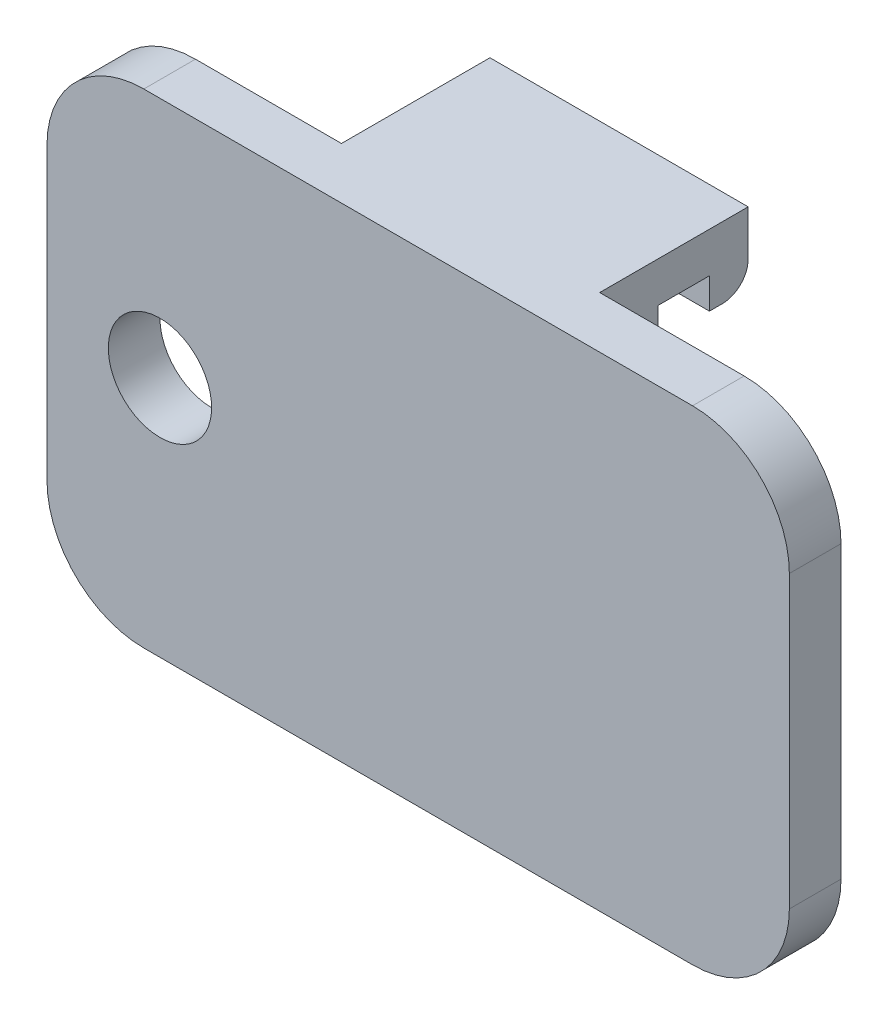
ISO-10303-21;
HEADER;
FILE_DESCRIPTION(('STEP AP214'),'2;1');
FILE_NAME('part.step','',(''),(''),'','','');
FILE_SCHEMA(('AUTOMOTIVE_DESIGN { 1 0 10303 214 1 1 1 1 }'));
ENDSEC;
DATA;
#1=APPLICATION_CONTEXT('core data for automotive mechanical design processes');
#2=APPLICATION_PROTOCOL_DEFINITION('international standard','automotive_design',2000,#1);
#3=PRODUCT_CONTEXT('',#1,'mechanical');
#4=PRODUCT('Part','Part','',(#3));
#5=PRODUCT_RELATED_PRODUCT_CATEGORY('part','',(#4));
#6=PRODUCT_DEFINITION_FORMATION('','',#4);
#7=PRODUCT_DEFINITION_CONTEXT('part definition',#1,'design');
#8=PRODUCT_DEFINITION('design','',#6,#7);
#9=PRODUCT_DEFINITION_SHAPE('','',#8);
#10=(LENGTH_UNIT() NAMED_UNIT(*) SI_UNIT(.MILLI.,.METRE.));
#11=(NAMED_UNIT(*) PLANE_ANGLE_UNIT() SI_UNIT($,.RADIAN.));
#12=(NAMED_UNIT(*) SI_UNIT($,.STERADIAN.) SOLID_ANGLE_UNIT());
#13=UNCERTAINTY_MEASURE_WITH_UNIT(LENGTH_MEASURE(1.E-05),#10,'distance_accuracy_value','');
#14=(GEOMETRIC_REPRESENTATION_CONTEXT(3) GLOBAL_UNCERTAINTY_ASSIGNED_CONTEXT((#13)) GLOBAL_UNIT_ASSIGNED_CONTEXT((#10,
#11,#12)) REPRESENTATION_CONTEXT('',''));
#15=CARTESIAN_POINT('',(0.,0.,0.));
#16=DIRECTION('',(0.,0.,1.));
#17=DIRECTION('',(1.,0.,0.));
#18=AXIS2_PLACEMENT_3D('',#15,#16,#17);
#19=CARTESIAN_POINT('',(0.,0.,-1.8));
#20=DIRECTION('',(0.,0.,1.));
#21=DIRECTION('',(1.,0.,0.));
#22=AXIS2_PLACEMENT_3D('',#19,#20,#21);
#23=PLANE('',#22);
#24=DIRECTION('',(-1.,0.,0.));
#25=VECTOR('',#24,1.);
#26=CARTESIAN_POINT('',(4.02357570217889,6.25,-1.8));
#27=LINE('',#26,#25);
#28=CARTESIAN_POINT('',(4.02357570217889,6.25,-1.8));
#29=VERTEX_POINT('',#28);
#30=CARTESIAN_POINT('',(-3.97642429782112,6.25,-1.8));
#31=VERTEX_POINT('',#30);
#32=EDGE_CURVE('E279',#29,#31,#27,.T.);
#33=ORIENTED_EDGE('',*,*,#32,.F.);
#34=DIRECTION('',(0.,-1.,0.));
#35=VECTOR('',#34,1.);
#36=CARTESIAN_POINT('',(4.02357570217889,7.5,-1.8));
#37=LINE('',#36,#35);
#38=CARTESIAN_POINT('',(4.02357570217889,3.5,-1.8));
#39=VERTEX_POINT('',#38);
#40=EDGE_CURVE('E299',#29,#39,#37,.T.);
#41=ORIENTED_EDGE('',*,*,#40,.T.);
#42=DIRECTION('',(-1.,0.,0.));
#43=VECTOR('',#42,1.);
#44=CARTESIAN_POINT('',(-3.97642429782112,3.5,-1.8));
#45=LINE('',#44,#43);
#46=CARTESIAN_POINT('',(-3.97642429782112,3.5,-1.8));
#47=VERTEX_POINT('',#46);
#48=EDGE_CURVE('E301',#39,#47,#45,.T.);
#49=ORIENTED_EDGE('',*,*,#48,.T.);
#50=DIRECTION('',(0.,1.,0.));
#51=VECTOR('',#50,1.);
#52=CARTESIAN_POINT('',(-3.97642429782112,7.5,-1.8));
#53=LINE('',#52,#51);
#54=EDGE_CURVE('E303',#47,#31,#53,.T.);
#55=ORIENTED_EDGE('',*,*,#54,.T.);
#56=EDGE_LOOP('',(#33,#41,#49,#55));
#57=FACE_BOUND('',#56,.T.);
#58=ADVANCED_FACE('F39',(#57),#23,.F.);
#59=CARTESIAN_POINT('',(0.,0.,0.));
#60=DIRECTION('',(0.,0.,1.));
#61=DIRECTION('',(1.,0.,0.));
#62=AXIS2_PLACEMENT_3D('',#59,#60,#61);
#63=PLANE('',#62);
#64=CARTESIAN_POINT('',(-8.,0.,0.));
#65=DIRECTION('',(0.,0.,1.));
#66=DIRECTION('',(1.,0.,0.));
#67=AXIS2_PLACEMENT_3D('',#64,#65,#66);
#68=CIRCLE('',#67,1.6);
#69=CARTESIAN_POINT('',(-6.4,0.,0.));
#70=VERTEX_POINT('',#69);
#71=EDGE_CURVE('E318',#70,#70,#68,.T.);
#72=ORIENTED_EDGE('',*,*,#71,.T.);
#73=EDGE_LOOP('',(#72));
#74=FACE_BOUND('',#73,.T.);
#75=DIRECTION('',(0.,1.,0.));
#76=VECTOR('',#75,1.);
#77=CARTESIAN_POINT('',(11.5,-7.5,0.));
#78=LINE('',#77,#76);
#79=CARTESIAN_POINT('',(11.5,-4.5,0.));
#80=VERTEX_POINT('',#79);
#81=CARTESIAN_POINT('',(11.5,4.5,0.));
#82=VERTEX_POINT('',#81);
#83=EDGE_CURVE('E367',#80,#82,#78,.T.);
#84=ORIENTED_EDGE('',*,*,#83,.F.);
#85=CARTESIAN_POINT('',(8.5,-4.5,0.));
#86=DIRECTION('',(0.,0.,1.));
#87=DIRECTION('',(1.,0.,0.));
#88=AXIS2_PLACEMENT_3D('',#85,#86,#87);
#89=CIRCLE('',#88,3.);
#90=CARTESIAN_POINT('',(8.5,-7.5,0.));
#91=VERTEX_POINT('',#90);
#92=EDGE_CURVE('E398',#80,#91,#89,.F.);
#93=ORIENTED_EDGE('',*,*,#92,.T.);
#94=DIRECTION('',(1.,0.,0.));
#95=VECTOR('',#94,1.);
#96=CARTESIAN_POINT('',(11.5,-7.5,0.));
#97=LINE('',#96,#95);
#98=CARTESIAN_POINT('',(4.02357570217889,-7.5,0.));
#99=VERTEX_POINT('',#98);
#100=EDGE_CURVE('E364',#99,#91,#97,.T.);
#101=ORIENTED_EDGE('',*,*,#100,.F.);
#102=DIRECTION('',(0.,-1.,0.));
#103=VECTOR('',#102,1.);
#104=CARTESIAN_POINT('',(4.02357570217889,-7.50000000000001,0.));
#105=LINE('',#104,#103);
#106=CARTESIAN_POINT('',(4.02357570217889,-3.5,0.));
#107=VERTEX_POINT('',#106);
#108=EDGE_CURVE('E331',#107,#99,#105,.T.);
#109=ORIENTED_EDGE('',*,*,#108,.F.);
#110=DIRECTION('',(1.,0.,0.));
#111=VECTOR('',#110,1.);
#112=CARTESIAN_POINT('',(-3.97642429782112,-3.5,0.));
#113=LINE('',#112,#111);
#114=CARTESIAN_POINT('',(-3.97642429782112,-3.5,0.));
#115=VERTEX_POINT('',#114);
#116=EDGE_CURVE('E334',#115,#107,#113,.T.);
#117=ORIENTED_EDGE('',*,*,#116,.F.);
#118=DIRECTION('',(0.,1.,0.));
#119=VECTOR('',#118,1.);
#120=CARTESIAN_POINT('',(-3.97642429782112,-7.50000000000001,0.));
#121=LINE('',#120,#119);
#122=CARTESIAN_POINT('',(-3.97642429782111,-7.5,0.));
#123=VERTEX_POINT('',#122);
#124=EDGE_CURVE('E309',#123,#115,#121,.T.);
#125=ORIENTED_EDGE('',*,*,#124,.F.);
#126=CARTESIAN_POINT('',(-8.5,-7.5,0.));
#127=VERTEX_POINT('',#126);
#128=EDGE_CURVE('E365',#127,#123,#97,.T.);
#129=ORIENTED_EDGE('',*,*,#128,.F.);
#130=CARTESIAN_POINT('',(-8.5,-4.5,0.));
#131=DIRECTION('',(0.,0.,1.));
#132=DIRECTION('',(1.,0.,0.));
#133=AXIS2_PLACEMENT_3D('',#130,#131,#132);
#134=CIRCLE('',#133,3.);
#135=CARTESIAN_POINT('',(-11.5,-4.5,0.));
#136=VERTEX_POINT('',#135);
#137=EDGE_CURVE('E394',#127,#136,#134,.F.);
#138=ORIENTED_EDGE('',*,*,#137,.T.);
#139=DIRECTION('',(0.,-1.,0.));
#140=VECTOR('',#139,1.);
#141=CARTESIAN_POINT('',(-11.5,-7.5,0.));
#142=LINE('',#141,#140);
#143=CARTESIAN_POINT('',(-11.5,4.5,0.));
#144=VERTEX_POINT('',#143);
#145=EDGE_CURVE('E347',#144,#136,#142,.T.);
#146=ORIENTED_EDGE('',*,*,#145,.F.);
#147=CARTESIAN_POINT('',(-8.5,4.5,0.));
#148=DIRECTION('',(0.,0.,1.));
#149=DIRECTION('',(1.,0.,0.));
#150=AXIS2_PLACEMENT_3D('',#147,#148,#149);
#151=CIRCLE('',#150,3.);
#152=CARTESIAN_POINT('',(-8.5,7.5,0.));
#153=VERTEX_POINT('',#152);
#154=EDGE_CURVE('E392',#144,#153,#151,.F.);
#155=ORIENTED_EDGE('',*,*,#154,.T.);
#156=DIRECTION('',(-1.,0.,0.));
#157=VECTOR('',#156,1.);
#158=CARTESIAN_POINT('',(11.5,7.5,0.));
#159=LINE('',#158,#157);
#160=CARTESIAN_POINT('',(-3.97642429782111,7.5,0.));
#161=VERTEX_POINT('',#160);
#162=EDGE_CURVE('E370',#161,#153,#159,.T.);
#163=ORIENTED_EDGE('',*,*,#162,.F.);
#164=DIRECTION('',(0.,1.,0.));
#165=VECTOR('',#164,1.);
#166=CARTESIAN_POINT('',(-3.97642429782112,7.5,0.));
#167=LINE('',#166,#165);
#168=CARTESIAN_POINT('',(-3.97642429782112,3.5,0.));
#169=VERTEX_POINT('',#168);
#170=EDGE_CURVE('E231',#169,#161,#167,.T.);
#171=ORIENTED_EDGE('',*,*,#170,.F.);
#172=DIRECTION('',(-1.,0.,0.));
#173=VECTOR('',#172,1.);
#174=CARTESIAN_POINT('',(-3.97642429782112,3.5,0.));
#175=LINE('',#174,#173);
#176=CARTESIAN_POINT('',(4.02357570217889,3.5,0.));
#177=VERTEX_POINT('',#176);
#178=EDGE_CURVE('E308',#177,#169,#175,.T.);
#179=ORIENTED_EDGE('',*,*,#178,.F.);
#180=DIRECTION('',(0.,-1.,0.));
#181=VECTOR('',#180,1.);
#182=CARTESIAN_POINT('',(4.02357570217889,7.5,0.));
#183=LINE('',#182,#181);
#184=CARTESIAN_POINT('',(4.02357570217889,7.5,0.));
#185=VERTEX_POINT('',#184);
#186=EDGE_CURVE('E305',#185,#177,#183,.T.);
#187=ORIENTED_EDGE('',*,*,#186,.F.);
#188=CARTESIAN_POINT('',(8.5,7.5,0.));
#189=VERTEX_POINT('',#188);
#190=EDGE_CURVE('E354',#189,#185,#159,.T.);
#191=ORIENTED_EDGE('',*,*,#190,.F.);
#192=CARTESIAN_POINT('',(8.5,4.5,0.));
#193=DIRECTION('',(0.,0.,1.));
#194=DIRECTION('',(1.,0.,0.));
#195=AXIS2_PLACEMENT_3D('',#192,#193,#194);
#196=CIRCLE('',#195,3.);
#197=EDGE_CURVE('E396',#189,#82,#196,.F.);
#198=ORIENTED_EDGE('',*,*,#197,.T.);
#199=EDGE_LOOP('',(#84,#93,#101,#109,#117,#125,#129,#138,#146,#155,#163,#171,#179,#187,#191,#198));
#200=FACE_BOUND('',#199,.T.);
#201=ADVANCED_FACE('F426',(#74,#200),#63,.F.);
#202=CARTESIAN_POINT('',(0.,0.,1.6));
#203=DIRECTION('',(0.,0.,1.));
#204=DIRECTION('',(1.,0.,0.));
#205=AXIS2_PLACEMENT_3D('',#202,#203,#204);
#206=PLANE('',#205);
#207=DIRECTION('',(1.,0.,0.));
#208=VECTOR('',#207,1.);
#209=CARTESIAN_POINT('',(11.5,-7.5,1.6));
#210=LINE('',#209,#208);
#211=CARTESIAN_POINT('',(-8.5,-7.5,1.6));
#212=VERTEX_POINT('',#211);
#213=CARTESIAN_POINT('',(8.5,-7.5,1.6));
#214=VERTEX_POINT('',#213);
#215=EDGE_CURVE('E353',#212,#214,#210,.T.);
#216=ORIENTED_EDGE('',*,*,#215,.T.);
#217=CARTESIAN_POINT('',(8.5,-4.5,1.6));
#218=DIRECTION('',(0.,0.,1.));
#219=DIRECTION('',(1.,0.,0.));
#220=AXIS2_PLACEMENT_3D('',#217,#218,#219);
#221=CIRCLE('',#220,3.);
#222=CARTESIAN_POINT('',(11.5,-4.5,1.6));
#223=VERTEX_POINT('',#222);
#224=EDGE_CURVE('E410',#214,#223,#221,.T.);
#225=ORIENTED_EDGE('',*,*,#224,.T.);
#226=DIRECTION('',(0.,1.,0.));
#227=VECTOR('',#226,1.);
#228=CARTESIAN_POINT('',(11.5,-7.5,1.6));
#229=LINE('',#228,#227);
#230=CARTESIAN_POINT('',(11.5,4.5,1.6));
#231=VERTEX_POINT('',#230);
#232=EDGE_CURVE('E357',#223,#231,#229,.T.);
#233=ORIENTED_EDGE('',*,*,#232,.T.);
#234=CARTESIAN_POINT('',(8.5,4.5,1.6));
#235=DIRECTION('',(0.,0.,1.));
#236=DIRECTION('',(1.,0.,0.));
#237=AXIS2_PLACEMENT_3D('',#234,#235,#236);
#238=CIRCLE('',#237,3.);
#239=CARTESIAN_POINT('',(8.5,7.5,1.6));
#240=VERTEX_POINT('',#239);
#241=EDGE_CURVE('E61',#231,#240,#238,.T.);
#242=ORIENTED_EDGE('',*,*,#241,.T.);
#243=DIRECTION('',(-1.,0.,0.));
#244=VECTOR('',#243,1.);
#245=CARTESIAN_POINT('',(11.5,7.5,1.6));
#246=LINE('',#245,#244);
#247=CARTESIAN_POINT('',(-8.5,7.5,1.6));
#248=VERTEX_POINT('',#247);
#249=EDGE_CURVE('E359',#240,#248,#246,.T.);
#250=ORIENTED_EDGE('',*,*,#249,.T.);
#251=CARTESIAN_POINT('',(-8.5,4.5,1.6));
#252=DIRECTION('',(0.,0.,1.));
#253=DIRECTION('',(1.,0.,0.));
#254=AXIS2_PLACEMENT_3D('',#251,#252,#253);
#255=CIRCLE('',#254,3.);
#256=CARTESIAN_POINT('',(-11.5,4.5,1.6));
#257=VERTEX_POINT('',#256);
#258=EDGE_CURVE('E405',#248,#257,#255,.T.);
#259=ORIENTED_EDGE('',*,*,#258,.T.);
#260=DIRECTION('',(0.,-1.,0.));
#261=VECTOR('',#260,1.);
#262=CARTESIAN_POINT('',(-11.5,-7.5,1.6));
#263=LINE('',#262,#261);
#264=CARTESIAN_POINT('',(-11.5,-4.5,1.6));
#265=VERTEX_POINT('',#264);
#266=EDGE_CURVE('E350',#257,#265,#263,.T.);
#267=ORIENTED_EDGE('',*,*,#266,.T.);
#268=CARTESIAN_POINT('',(-8.5,-4.5,1.6));
#269=DIRECTION('',(0.,0.,1.));
#270=DIRECTION('',(1.,0.,0.));
#271=AXIS2_PLACEMENT_3D('',#268,#269,#270);
#272=CIRCLE('',#271,3.);
#273=EDGE_CURVE('E407',#265,#212,#272,.T.);
#274=ORIENTED_EDGE('',*,*,#273,.T.);
#275=EDGE_LOOP('',(#216,#225,#233,#242,#250,#259,#267,#274));
#276=FACE_BOUND('',#275,.T.);
#277=CARTESIAN_POINT('',(-8.,0.,1.6));
#278=DIRECTION('',(0.,0.,1.));
#279=DIRECTION('',(1.,0.,0.));
#280=AXIS2_PLACEMENT_3D('',#277,#278,#279);
#281=CIRCLE('',#280,1.6);
#282=CARTESIAN_POINT('',(-6.4,0.,1.6));
#283=VERTEX_POINT('',#282);
#284=EDGE_CURVE('E344',#283,#283,#281,.T.);
#285=ORIENTED_EDGE('',*,*,#284,.F.);
#286=EDGE_LOOP('',(#285));
#287=FACE_BOUND('',#286,.T.);
#288=ADVANCED_FACE('F439',(#276,#287),#206,.T.);
#289=CARTESIAN_POINT('',(-11.5,-7.5,1.6));
#290=DIRECTION('',(1.,0.,0.));
#291=DIRECTION('',(0.,0.,-1.));
#292=AXIS2_PLACEMENT_3D('',#289,#290,#291);
#293=PLANE('',#292);
#294=ORIENTED_EDGE('',*,*,#145,.T.);
#295=DIRECTION('',(0.,0.,-1.));
#296=VECTOR('',#295,1.);
#297=CARTESIAN_POINT('',(-11.5,-4.5,1.6));
#298=LINE('',#297,#296);
#299=EDGE_CURVE('E11',#136,#265,#298,.F.);
#300=ORIENTED_EDGE('',*,*,#299,.T.);
#301=ORIENTED_EDGE('',*,*,#266,.F.);
#302=DIRECTION('',(0.,0.,-1.));
#303=VECTOR('',#302,1.);
#304=CARTESIAN_POINT('',(-11.5,4.5,1.6));
#305=LINE('',#304,#303);
#306=EDGE_CURVE('E47',#257,#144,#305,.T.);
#307=ORIENTED_EDGE('',*,*,#306,.T.);
#308=EDGE_LOOP('',(#294,#300,#301,#307));
#309=FACE_BOUND('',#308,.T.);
#310=ADVANCED_FACE('F420',(#309),#293,.F.);
#311=CARTESIAN_POINT('',(11.5,-7.5,1.6));
#312=DIRECTION('',(0.,1.,0.));
#313=DIRECTION('',(-1.,0.,0.));
#314=AXIS2_PLACEMENT_3D('',#311,#312,#313);
#315=PLANE('',#314);
#316=ORIENTED_EDGE('',*,*,#100,.T.);
#317=DIRECTION('',(0.,0.,-1.));
#318=VECTOR('',#317,1.);
#319=CARTESIAN_POINT('',(8.5,-7.5,1.6));
#320=LINE('',#319,#318);
#321=EDGE_CURVE('E403',#91,#214,#320,.F.);
#322=ORIENTED_EDGE('',*,*,#321,.T.);
#323=ORIENTED_EDGE('',*,*,#215,.F.);
#324=DIRECTION('',(0.,0.,-1.));
#325=VECTOR('',#324,1.);
#326=CARTESIAN_POINT('',(-8.5,-7.5,1.6));
#327=LINE('',#326,#325);
#328=EDGE_CURVE('E400',#212,#127,#327,.T.);
#329=ORIENTED_EDGE('',*,*,#328,.T.);
#330=ORIENTED_EDGE('',*,*,#128,.T.);
#331=DIRECTION('',(0.,0.,1.));
#332=VECTOR('',#331,1.);
#333=CARTESIAN_POINT('',(-3.97642429782112,-7.50000000000001,-1.8));
#334=LINE('',#333,#332);
#335=CARTESIAN_POINT('',(-3.97642429782111,-7.5,-4.6));
#336=VERTEX_POINT('',#335);
#337=EDGE_CURVE('E327',#336,#123,#334,.T.);
#338=ORIENTED_EDGE('',*,*,#337,.F.);
#339=DIRECTION('',(-1.,0.,0.));
#340=VECTOR('',#339,1.);
#341=CARTESIAN_POINT('',(4.02357570217889,-7.5,-4.6));
#342=LINE('',#341,#340);
#343=CARTESIAN_POINT('',(4.02357570217889,-7.5,-4.6));
#344=VERTEX_POINT('',#343);
#345=EDGE_CURVE('E271',#344,#336,#342,.T.);
#346=ORIENTED_EDGE('',*,*,#345,.F.);
#347=DIRECTION('',(0.,0.,1.));
#348=VECTOR('',#347,1.);
#349=CARTESIAN_POINT('',(4.02357570217889,-7.50000000000001,-1.8));
#350=LINE('',#349,#348);
#351=EDGE_CURVE('E324',#344,#99,#350,.T.);
#352=ORIENTED_EDGE('',*,*,#351,.T.);
#353=EDGE_LOOP('',(#316,#322,#323,#329,#330,#338,#346,#352));
#354=FACE_BOUND('',#353,.T.);
#355=ADVANCED_FACE('F436',(#354),#315,.F.);
#356=CARTESIAN_POINT('',(11.5,-7.5,1.6));
#357=DIRECTION('',(-1.,0.,0.));
#358=DIRECTION('',(0.,0.,1.));
#359=AXIS2_PLACEMENT_3D('',#356,#357,#358);
#360=PLANE('',#359);
#361=ORIENTED_EDGE('',*,*,#232,.F.);
#362=DIRECTION('',(0.,0.,-1.));
#363=VECTOR('',#362,1.);
#364=CARTESIAN_POINT('',(11.5,-4.5,1.6));
#365=LINE('',#364,#363);
#366=EDGE_CURVE('E389',#223,#80,#365,.T.);
#367=ORIENTED_EDGE('',*,*,#366,.T.);
#368=ORIENTED_EDGE('',*,*,#83,.T.);
#369=DIRECTION('',(0.,0.,-1.));
#370=VECTOR('',#369,1.);
#371=CARTESIAN_POINT('',(11.5,4.5,1.6));
#372=LINE('',#371,#370);
#373=EDGE_CURVE('E387',#82,#231,#372,.F.);
#374=ORIENTED_EDGE('',*,*,#373,.T.);
#375=EDGE_LOOP('',(#361,#367,#368,#374));
#376=FACE_BOUND('',#375,.T.);
#377=ADVANCED_FACE('F446',(#376),#360,.F.);
#378=CARTESIAN_POINT('',(11.5,7.5,1.6));
#379=DIRECTION('',(0.,-1.,0.));
#380=DIRECTION('',(1.,0.,0.));
#381=AXIS2_PLACEMENT_3D('',#378,#379,#380);
#382=PLANE('',#381);
#383=ORIENTED_EDGE('',*,*,#249,.F.);
#384=DIRECTION('',(0.,0.,-1.));
#385=VECTOR('',#384,1.);
#386=CARTESIAN_POINT('',(8.5,7.5,1.6));
#387=LINE('',#386,#385);
#388=EDGE_CURVE('E413',#240,#189,#387,.T.);
#389=ORIENTED_EDGE('',*,*,#388,.T.);
#390=ORIENTED_EDGE('',*,*,#190,.T.);
#391=DIRECTION('',(0.,0.,1.));
#392=VECTOR('',#391,1.);
#393=CARTESIAN_POINT('',(4.02357570217889,7.5,-1.8));
#394=LINE('',#393,#392);
#395=CARTESIAN_POINT('',(4.02357570217889,7.5,-4.6));
#396=VERTEX_POINT('',#395);
#397=EDGE_CURVE('E233',#396,#185,#394,.T.);
#398=ORIENTED_EDGE('',*,*,#397,.F.);
#399=DIRECTION('',(1.,0.,0.));
#400=VECTOR('',#399,1.);
#401=CARTESIAN_POINT('',(4.02357570217889,7.5,-4.6));
#402=LINE('',#401,#400);
#403=CARTESIAN_POINT('',(-3.97642429782111,7.5,-4.6));
#404=VERTEX_POINT('',#403);
#405=EDGE_CURVE('E219',#404,#396,#402,.T.);
#406=ORIENTED_EDGE('',*,*,#405,.F.);
#407=DIRECTION('',(0.,0.,1.));
#408=VECTOR('',#407,1.);
#409=CARTESIAN_POINT('',(-3.97642429782112,7.5,-1.8));
#410=LINE('',#409,#408);
#411=EDGE_CURVE('E228',#404,#161,#410,.T.);
#412=ORIENTED_EDGE('',*,*,#411,.T.);
#413=ORIENTED_EDGE('',*,*,#162,.T.);
#414=DIRECTION('',(0.,0.,-1.));
#415=VECTOR('',#414,1.);
#416=CARTESIAN_POINT('',(-8.5,7.5,1.6));
#417=LINE('',#416,#415);
#418=EDGE_CURVE('E54',#153,#248,#417,.F.);
#419=ORIENTED_EDGE('',*,*,#418,.T.);
#420=EDGE_LOOP('',(#383,#389,#390,#398,#406,#412,#413,#419));
#421=FACE_BOUND('',#420,.T.);
#422=ADVANCED_FACE('F235',(#421),#382,.F.);
#423=CARTESIAN_POINT('',(-8.,0.,1.6));
#424=DIRECTION('',(0.,0.,-1.));
#425=DIRECTION('',(-1.,0.,0.));
#426=AXIS2_PLACEMENT_3D('',#423,#424,#425);
#427=CYLINDRICAL_SURFACE('',#426,1.6);
#428=ORIENTED_EDGE('',*,*,#284,.T.);
#429=EDGE_LOOP('',(#428));
#430=FACE_BOUND('',#429,.T.);
#431=ORIENTED_EDGE('',*,*,#71,.F.);
#432=EDGE_LOOP('',(#431));
#433=FACE_BOUND('',#432,.T.);
#434=ADVANCED_FACE('F486',(#430,#433),#427,.F.);
#435=CARTESIAN_POINT('',(-3.97642429782112,-7.50000000000001,-1.8));
#436=DIRECTION('',(1.,0.,0.));
#437=DIRECTION('',(0.,0.,-1.));
#438=AXIS2_PLACEMENT_3D('',#435,#436,#437);
#439=PLANE('',#438);
#440=DIRECTION('',(0.,0.,1.));
#441=VECTOR('',#440,1.);
#442=CARTESIAN_POINT('',(-3.97642429782112,-5.3,-4.6));
#443=LINE('',#442,#441);
#444=CARTESIAN_POINT('',(-3.97642429782112,-5.3,-3.8));
#445=VERTEX_POINT('',#444);
#446=CARTESIAN_POINT('',(-3.97642429782112,-5.3,-3.4));
#447=VERTEX_POINT('',#446);
#448=EDGE_CURVE('E255',#445,#447,#443,.T.);
#449=ORIENTED_EDGE('',*,*,#448,.F.);
#450=CARTESIAN_POINT('',(-3.97642429782112,-6.1,-3.8));
#451=DIRECTION('',(1.,0.,0.));
#452=DIRECTION('',(0.,0.,-1.));
#453=AXIS2_PLACEMENT_3D('',#450,#451,#452);
#454=CIRCLE('',#453,0.8);
#455=CARTESIAN_POINT('',(-3.97642429782112,-6.1,-4.6));
#456=VERTEX_POINT('',#455);
#457=EDGE_CURVE('E378',#445,#456,#454,.F.);
#458=ORIENTED_EDGE('',*,*,#457,.T.);
#459=DIRECTION('',(0.,1.,0.));
#460=VECTOR('',#459,1.);
#461=CARTESIAN_POINT('',(-3.97642429782112,-5.3,-4.6));
#462=LINE('',#461,#460);
#463=EDGE_CURVE('E259',#336,#456,#462,.T.);
#464=ORIENTED_EDGE('',*,*,#463,.F.);
#465=ORIENTED_EDGE('',*,*,#337,.T.);
#466=ORIENTED_EDGE('',*,*,#124,.T.);
#467=DIRECTION('',(0.,0.,1.));
#468=VECTOR('',#467,1.);
#469=CARTESIAN_POINT('',(-3.97642429782112,-3.5,-1.8));
#470=LINE('',#469,#468);
#471=CARTESIAN_POINT('',(-3.97642429782112,-3.5,-1.8));
#472=VERTEX_POINT('',#471);
#473=EDGE_CURVE('E288',#472,#115,#470,.T.);
#474=ORIENTED_EDGE('',*,*,#473,.F.);
#475=DIRECTION('',(0.,1.,0.));
#476=VECTOR('',#475,1.);
#477=CARTESIAN_POINT('',(-3.97642429782112,-7.50000000000001,-1.8));
#478=LINE('',#477,#476);
#479=CARTESIAN_POINT('',(-3.97642429782112,-6.25,-1.8));
#480=VERTEX_POINT('',#479);
#481=EDGE_CURVE('E335',#480,#472,#478,.T.);
#482=ORIENTED_EDGE('',*,*,#481,.F.);
#483=DIRECTION('',(0.,0.,1.));
#484=VECTOR('',#483,1.);
#485=CARTESIAN_POINT('',(-3.97642429782112,-6.25,-3.4));
#486=LINE('',#485,#484);
#487=CARTESIAN_POINT('',(-3.97642429782112,-6.25,-3.4));
#488=VERTEX_POINT('',#487);
#489=EDGE_CURVE('E254',#488,#480,#486,.T.);
#490=ORIENTED_EDGE('',*,*,#489,.F.);
#491=DIRECTION('',(0.,1.,0.));
#492=VECTOR('',#491,1.);
#493=CARTESIAN_POINT('',(-3.97642429782112,-5.3,-3.4));
#494=LINE('',#493,#492);
#495=EDGE_CURVE('E263',#488,#447,#494,.T.);
#496=ORIENTED_EDGE('',*,*,#495,.T.);
#497=EDGE_LOOP('',(#449,#458,#464,#465,#466,#474,#482,#490,#496));
#498=FACE_BOUND('',#497,.T.);
#499=ADVANCED_FACE('F482',(#498),#439,.F.);
#500=CARTESIAN_POINT('',(-3.97642429782112,-3.5,-1.8));
#501=DIRECTION('',(0.,-1.,0.));
#502=DIRECTION('',(0.,0.,-1.));
#503=AXIS2_PLACEMENT_3D('',#500,#501,#502);
#504=PLANE('',#503);
#505=ORIENTED_EDGE('',*,*,#116,.T.);
#506=DIRECTION('',(0.,0.,1.));
#507=VECTOR('',#506,1.);
#508=CARTESIAN_POINT('',(4.02357570217889,-3.5,-1.8));
#509=LINE('',#508,#507);
#510=CARTESIAN_POINT('',(4.02357570217889,-3.5,-1.8));
#511=VERTEX_POINT('',#510);
#512=EDGE_CURVE('E321',#511,#107,#509,.T.);
#513=ORIENTED_EDGE('',*,*,#512,.F.);
#514=DIRECTION('',(1.,0.,0.));
#515=VECTOR('',#514,1.);
#516=CARTESIAN_POINT('',(-3.97642429782112,-3.5,-1.8));
#517=LINE('',#516,#515);
#518=EDGE_CURVE('E341',#472,#511,#517,.T.);
#519=ORIENTED_EDGE('',*,*,#518,.F.);
#520=ORIENTED_EDGE('',*,*,#473,.T.);
#521=EDGE_LOOP('',(#505,#513,#519,#520));
#522=FACE_BOUND('',#521,.T.);
#523=ADVANCED_FACE('F485',(#522),#504,.F.);
#524=CARTESIAN_POINT('',(4.02357570217889,-7.50000000000001,-1.8));
#525=DIRECTION('',(-1.,0.,0.));
#526=DIRECTION('',(0.,0.,1.));
#527=AXIS2_PLACEMENT_3D('',#524,#525,#526);
#528=PLANE('',#527);
#529=DIRECTION('',(0.,-1.,0.));
#530=VECTOR('',#529,1.);
#531=CARTESIAN_POINT('',(4.02357570217889,-5.3,-4.6));
#532=LINE('',#531,#530);
#533=CARTESIAN_POINT('',(4.02357570217889,-6.1,-4.6));
#534=VERTEX_POINT('',#533);
#535=EDGE_CURVE('E264',#534,#344,#532,.T.);
#536=ORIENTED_EDGE('',*,*,#535,.F.);
#537=CARTESIAN_POINT('',(4.02357570217889,-6.1,-3.8));
#538=DIRECTION('',(-1.,0.,0.));
#539=DIRECTION('',(0.,0.,1.));
#540=AXIS2_PLACEMENT_3D('',#537,#538,#539);
#541=CIRCLE('',#540,0.8);
#542=CARTESIAN_POINT('',(4.02357570217889,-5.3,-3.8));
#543=VERTEX_POINT('',#542);
#544=EDGE_CURVE('E374',#534,#543,#541,.F.);
#545=ORIENTED_EDGE('',*,*,#544,.T.);
#546=DIRECTION('',(0.,0.,1.));
#547=VECTOR('',#546,1.);
#548=CARTESIAN_POINT('',(4.02357570217889,-5.3,-4.6));
#549=LINE('',#548,#547);
#550=CARTESIAN_POINT('',(4.02357570217889,-5.3,-3.4));
#551=VERTEX_POINT('',#550);
#552=EDGE_CURVE('E257',#543,#551,#549,.T.);
#553=ORIENTED_EDGE('',*,*,#552,.T.);
#554=DIRECTION('',(0.,-1.,0.));
#555=VECTOR('',#554,1.);
#556=CARTESIAN_POINT('',(4.02357570217889,-5.3,-3.4));
#557=LINE('',#556,#555);
#558=CARTESIAN_POINT('',(4.02357570217889,-6.25,-3.4));
#559=VERTEX_POINT('',#558);
#560=EDGE_CURVE('E246',#551,#559,#557,.T.);
#561=ORIENTED_EDGE('',*,*,#560,.T.);
#562=DIRECTION('',(0.,0.,1.));
#563=VECTOR('',#562,1.);
#564=CARTESIAN_POINT('',(4.02357570217889,-6.25,-3.4));
#565=LINE('',#564,#563);
#566=CARTESIAN_POINT('',(4.02357570217889,-6.25,-1.8));
#567=VERTEX_POINT('',#566);
#568=EDGE_CURVE('E291',#559,#567,#565,.T.);
#569=ORIENTED_EDGE('',*,*,#568,.T.);
#570=DIRECTION('',(0.,-1.,0.));
#571=VECTOR('',#570,1.);
#572=CARTESIAN_POINT('',(4.02357570217889,-7.50000000000001,-1.8));
#573=LINE('',#572,#571);
#574=EDGE_CURVE('E330',#511,#567,#573,.T.);
#575=ORIENTED_EDGE('',*,*,#574,.F.);
#576=ORIENTED_EDGE('',*,*,#512,.T.);
#577=ORIENTED_EDGE('',*,*,#108,.T.);
#578=ORIENTED_EDGE('',*,*,#351,.F.);
#579=EDGE_LOOP('',(#536,#545,#553,#561,#569,#575,#576,#577,#578));
#580=FACE_BOUND('',#579,.T.);
#581=ADVANCED_FACE('F490',(#580),#528,.F.);
#582=CARTESIAN_POINT('',(0.,0.,-1.8));
#583=DIRECTION('',(0.,0.,-1.));
#584=DIRECTION('',(-1.,0.,0.));
#585=AXIS2_PLACEMENT_3D('',#582,#583,#584);
#586=PLANE('',#585);
#587=DIRECTION('',(1.,0.,0.));
#588=VECTOR('',#587,1.);
#589=CARTESIAN_POINT('',(4.02357570217889,-6.25,-1.8));
#590=LINE('',#589,#588);
#591=EDGE_CURVE('E282',#480,#567,#590,.T.);
#592=ORIENTED_EDGE('',*,*,#591,.F.);
#593=ORIENTED_EDGE('',*,*,#481,.T.);
#594=ORIENTED_EDGE('',*,*,#518,.T.);
#595=ORIENTED_EDGE('',*,*,#574,.T.);
#596=EDGE_LOOP('',(#592,#593,#594,#595));
#597=FACE_BOUND('',#596,.T.);
#598=ADVANCED_FACE('F480',(#597),#586,.T.);
#599=CARTESIAN_POINT('',(4.02357570217889,7.5,-1.8));
#600=DIRECTION('',(-1.,0.,0.));
#601=DIRECTION('',(0.,0.,1.));
#602=AXIS2_PLACEMENT_3D('',#599,#600,#601);
#603=PLANE('',#602);
#604=DIRECTION('',(0.,0.,1.));
#605=VECTOR('',#604,1.);
#606=CARTESIAN_POINT('',(4.02357570217889,5.3,-4.6));
#607=LINE('',#606,#605);
#608=CARTESIAN_POINT('',(4.02357570217889,5.3,-3.8));
#609=VERTEX_POINT('',#608);
#610=CARTESIAN_POINT('',(4.02357570217889,5.3,-3.4));
#611=VERTEX_POINT('',#610);
#612=EDGE_CURVE('E252',#609,#611,#607,.T.);
#613=ORIENTED_EDGE('',*,*,#612,.F.);
#614=CARTESIAN_POINT('',(4.02357570217889,6.1,-3.8));
#615=DIRECTION('',(-1.,0.,0.));
#616=DIRECTION('',(0.,0.,1.));
#617=AXIS2_PLACEMENT_3D('',#614,#615,#616);
#618=CIRCLE('',#617,0.8);
#619=CARTESIAN_POINT('',(4.02357570217889,6.1,-4.6));
#620=VERTEX_POINT('',#619);
#621=EDGE_CURVE('E385',#609,#620,#618,.F.);
#622=ORIENTED_EDGE('',*,*,#621,.T.);
#623=DIRECTION('',(0.,-1.,0.));
#624=VECTOR('',#623,1.);
#625=CARTESIAN_POINT('',(4.02357570217889,5.3,-4.6));
#626=LINE('',#625,#624);
#627=EDGE_CURVE('E237',#396,#620,#626,.T.);
#628=ORIENTED_EDGE('',*,*,#627,.F.);
#629=ORIENTED_EDGE('',*,*,#397,.T.);
#630=ORIENTED_EDGE('',*,*,#186,.T.);
#631=DIRECTION('',(0.,0.,1.));
#632=VECTOR('',#631,1.);
#633=CARTESIAN_POINT('',(4.02357570217889,3.5,-1.8));
#634=LINE('',#633,#632);
#635=EDGE_CURVE('E315',#39,#177,#634,.T.);
#636=ORIENTED_EDGE('',*,*,#635,.F.);
#637=ORIENTED_EDGE('',*,*,#40,.F.);
#638=DIRECTION('',(0.,0.,1.));
#639=VECTOR('',#638,1.);
#640=CARTESIAN_POINT('',(4.02357570217889,6.25,-3.4));
#641=LINE('',#640,#639);
#642=CARTESIAN_POINT('',(4.02357570217889,6.25,-3.4));
#643=VERTEX_POINT('',#642);
#644=EDGE_CURVE('E285',#643,#29,#641,.T.);
#645=ORIENTED_EDGE('',*,*,#644,.F.);
#646=DIRECTION('',(0.,-1.,0.));
#647=VECTOR('',#646,1.);
#648=CARTESIAN_POINT('',(4.02357570217889,5.3,-3.4));
#649=LINE('',#648,#647);
#650=EDGE_CURVE('E245',#643,#611,#649,.T.);
#651=ORIENTED_EDGE('',*,*,#650,.T.);
#652=EDGE_LOOP('',(#613,#622,#628,#629,#630,#636,#637,#645,#651));
#653=FACE_BOUND('',#652,.T.);
#654=ADVANCED_FACE('F476',(#653),#603,.F.);
#655=CARTESIAN_POINT('',(-3.97642429782112,3.5,-1.8));
#656=DIRECTION('',(0.,1.,0.));
#657=DIRECTION('',(0.,0.,1.));
#658=AXIS2_PLACEMENT_3D('',#655,#656,#657);
#659=PLANE('',#658);
#660=ORIENTED_EDGE('',*,*,#178,.T.);
#661=DIRECTION('',(0.,0.,1.));
#662=VECTOR('',#661,1.);
#663=CARTESIAN_POINT('',(-3.97642429782112,3.5,-1.8));
#664=LINE('',#663,#662);
#665=EDGE_CURVE('E232',#47,#169,#664,.T.);
#666=ORIENTED_EDGE('',*,*,#665,.F.);
#667=ORIENTED_EDGE('',*,*,#48,.F.);
#668=ORIENTED_EDGE('',*,*,#635,.T.);
#669=EDGE_LOOP('',(#660,#666,#667,#668));
#670=FACE_BOUND('',#669,.T.);
#671=ADVANCED_FACE('F474',(#670),#659,.F.);
#672=CARTESIAN_POINT('',(-3.97642429782112,7.5,-1.8));
#673=DIRECTION('',(1.,0.,0.));
#674=DIRECTION('',(0.,0.,-1.));
#675=AXIS2_PLACEMENT_3D('',#672,#673,#674);
#676=PLANE('',#675);
#677=DIRECTION('',(0.,1.,0.));
#678=VECTOR('',#677,1.);
#679=CARTESIAN_POINT('',(-3.97642429782112,5.3,-4.6));
#680=LINE('',#679,#678);
#681=CARTESIAN_POINT('',(-3.97642429782112,6.1,-4.6));
#682=VERTEX_POINT('',#681);
#683=EDGE_CURVE('E214',#682,#404,#680,.T.);
#684=ORIENTED_EDGE('',*,*,#683,.F.);
#685=CARTESIAN_POINT('',(-3.97642429782112,6.1,-3.8));
#686=DIRECTION('',(1.,0.,0.));
#687=DIRECTION('',(0.,0.,-1.));
#688=AXIS2_PLACEMENT_3D('',#685,#686,#687);
#689=CIRCLE('',#688,0.8);
#690=CARTESIAN_POINT('',(-3.97642429782112,5.3,-3.8));
#691=VERTEX_POINT('',#690);
#692=EDGE_CURVE('E381',#682,#691,#689,.F.);
#693=ORIENTED_EDGE('',*,*,#692,.T.);
#694=DIRECTION('',(0.,0.,1.));
#695=VECTOR('',#694,1.);
#696=CARTESIAN_POINT('',(-3.97642429782112,5.3,-4.6));
#697=LINE('',#696,#695);
#698=CARTESIAN_POINT('',(-3.97642429782112,5.3,-3.4));
#699=VERTEX_POINT('',#698);
#700=EDGE_CURVE('E239',#691,#699,#697,.T.);
#701=ORIENTED_EDGE('',*,*,#700,.T.);
#702=DIRECTION('',(0.,1.,0.));
#703=VECTOR('',#702,1.);
#704=CARTESIAN_POINT('',(-3.97642429782112,5.3,-3.4));
#705=LINE('',#704,#703);
#706=CARTESIAN_POINT('',(-3.97642429782112,6.25,-3.4));
#707=VERTEX_POINT('',#706);
#708=EDGE_CURVE('E242',#699,#707,#705,.T.);
#709=ORIENTED_EDGE('',*,*,#708,.T.);
#710=DIRECTION('',(0.,0.,1.));
#711=VECTOR('',#710,1.);
#712=CARTESIAN_POINT('',(-3.97642429782112,6.25,-3.4));
#713=LINE('',#712,#711);
#714=EDGE_CURVE('E278',#707,#31,#713,.T.);
#715=ORIENTED_EDGE('',*,*,#714,.T.);
#716=ORIENTED_EDGE('',*,*,#54,.F.);
#717=ORIENTED_EDGE('',*,*,#665,.T.);
#718=ORIENTED_EDGE('',*,*,#170,.T.);
#719=ORIENTED_EDGE('',*,*,#411,.F.);
#720=EDGE_LOOP('',(#684,#693,#701,#709,#715,#716,#717,#718,#719));
#721=FACE_BOUND('',#720,.T.);
#722=ADVANCED_FACE('F229',(#721),#676,.F.);
#723=CARTESIAN_POINT('',(4.02357570217889,6.25,-3.4));
#724=DIRECTION('',(0.,1.,0.));
#725=DIRECTION('',(0.,0.,1.));
#726=AXIS2_PLACEMENT_3D('',#723,#724,#725);
#727=PLANE('',#726);
#728=ORIENTED_EDGE('',*,*,#32,.T.);
#729=ORIENTED_EDGE('',*,*,#714,.F.);
#730=DIRECTION('',(-1.,0.,0.));
#731=VECTOR('',#730,1.);
#732=CARTESIAN_POINT('',(4.02357570217889,6.25,-3.4));
#733=LINE('',#732,#731);
#734=EDGE_CURVE('E275',#643,#707,#733,.T.);
#735=ORIENTED_EDGE('',*,*,#734,.F.);
#736=ORIENTED_EDGE('',*,*,#644,.T.);
#737=EDGE_LOOP('',(#728,#729,#735,#736));
#738=FACE_BOUND('',#737,.T.);
#739=ADVANCED_FACE('F473',(#738),#727,.F.);
#740=CARTESIAN_POINT('',(4.02357570217889,-6.25,-3.4));
#741=DIRECTION('',(0.,-1.,0.));
#742=DIRECTION('',(0.,0.,-1.));
#743=AXIS2_PLACEMENT_3D('',#740,#741,#742);
#744=PLANE('',#743);
#745=ORIENTED_EDGE('',*,*,#591,.T.);
#746=ORIENTED_EDGE('',*,*,#568,.F.);
#747=DIRECTION('',(1.,0.,0.));
#748=VECTOR('',#747,1.);
#749=CARTESIAN_POINT('',(4.02357570217889,-6.25,-3.4));
#750=LINE('',#749,#748);
#751=EDGE_CURVE('E294',#488,#559,#750,.T.);
#752=ORIENTED_EDGE('',*,*,#751,.F.);
#753=ORIENTED_EDGE('',*,*,#489,.T.);
#754=EDGE_LOOP('',(#745,#746,#752,#753));
#755=FACE_BOUND('',#754,.T.);
#756=ADVANCED_FACE('F469',(#755),#744,.F.);
#757=CARTESIAN_POINT('',(0.,0.,-3.4));
#758=DIRECTION('',(0.,0.,-1.));
#759=DIRECTION('',(-1.,0.,0.));
#760=AXIS2_PLACEMENT_3D('',#757,#758,#759);
#761=PLANE('',#760);
#762=ORIENTED_EDGE('',*,*,#495,.F.);
#763=ORIENTED_EDGE('',*,*,#751,.T.);
#764=ORIENTED_EDGE('',*,*,#560,.F.);
#765=DIRECTION('',(1.,0.,0.));
#766=VECTOR('',#765,1.);
#767=CARTESIAN_POINT('',(4.02357570217889,-5.3,-3.4));
#768=LINE('',#767,#766);
#769=EDGE_CURVE('E260',#447,#551,#768,.T.);
#770=ORIENTED_EDGE('',*,*,#769,.F.);
#771=EDGE_LOOP('',(#762,#763,#764,#770));
#772=FACE_BOUND('',#771,.T.);
#773=ADVANCED_FACE('F593',(#772),#761,.F.);
#774=CARTESIAN_POINT('',(4.02357570217889,-5.3,-4.6));
#775=DIRECTION('',(0.,-1.,0.));
#776=DIRECTION('',(0.,0.,-1.));
#777=AXIS2_PLACEMENT_3D('',#774,#775,#776);
#778=PLANE('',#777);
#779=ORIENTED_EDGE('',*,*,#552,.F.);
#780=DIRECTION('',(1.,0.,0.));
#781=VECTOR('',#780,1.);
#782=CARTESIAN_POINT('',(-3.97642429782112,-5.3,-3.8));
#783=LINE('',#782,#781);
#784=EDGE_CURVE('E376',#543,#445,#783,.F.);
#785=ORIENTED_EDGE('',*,*,#784,.T.);
#786=ORIENTED_EDGE('',*,*,#448,.T.);
#787=ORIENTED_EDGE('',*,*,#769,.T.);
#788=EDGE_LOOP('',(#779,#785,#786,#787));
#789=FACE_BOUND('',#788,.T.);
#790=ADVANCED_FACE('F584',(#789),#778,.F.);
#791=CARTESIAN_POINT('',(0.,0.,-4.6));
#792=DIRECTION('',(0.,0.,-1.));
#793=DIRECTION('',(-1.,0.,0.));
#794=AXIS2_PLACEMENT_3D('',#791,#792,#793);
#795=PLANE('',#794);
#796=ORIENTED_EDGE('',*,*,#463,.T.);
#797=DIRECTION('',(1.,0.,0.));
#798=VECTOR('',#797,1.);
#799=CARTESIAN_POINT('',(4.02357570217889,-6.1,-4.6));
#800=LINE('',#799,#798);
#801=EDGE_CURVE('E361',#456,#534,#800,.T.);
#802=ORIENTED_EDGE('',*,*,#801,.T.);
#803=ORIENTED_EDGE('',*,*,#535,.T.);
#804=ORIENTED_EDGE('',*,*,#345,.T.);
#805=EDGE_LOOP('',(#796,#802,#803,#804));
#806=FACE_BOUND('',#805,.T.);
#807=ADVANCED_FACE('F575',(#806),#795,.T.);
#808=CARTESIAN_POINT('',(4.02357570217889,5.3,-4.6));
#809=DIRECTION('',(0.,1.,0.));
#810=DIRECTION('',(0.,0.,1.));
#811=AXIS2_PLACEMENT_3D('',#808,#809,#810);
#812=PLANE('',#811);
#813=ORIENTED_EDGE('',*,*,#700,.F.);
#814=DIRECTION('',(-1.,0.,0.));
#815=VECTOR('',#814,1.);
#816=CARTESIAN_POINT('',(4.02357570217889,5.3,-3.8));
#817=LINE('',#816,#815);
#818=EDGE_CURVE('E383',#691,#609,#817,.F.);
#819=ORIENTED_EDGE('',*,*,#818,.T.);
#820=ORIENTED_EDGE('',*,*,#612,.T.);
#821=DIRECTION('',(-1.,0.,0.));
#822=VECTOR('',#821,1.);
#823=CARTESIAN_POINT('',(4.02357570217889,5.3,-3.4));
#824=LINE('',#823,#822);
#825=EDGE_CURVE('E224',#611,#699,#824,.T.);
#826=ORIENTED_EDGE('',*,*,#825,.T.);
#827=EDGE_LOOP('',(#813,#819,#820,#826));
#828=FACE_BOUND('',#827,.T.);
#829=ADVANCED_FACE('F567',(#828),#812,.F.);
#830=CARTESIAN_POINT('',(0.,0.,-4.6));
#831=DIRECTION('',(0.,0.,1.));
#832=DIRECTION('',(1.,0.,0.));
#833=AXIS2_PLACEMENT_3D('',#830,#831,#832);
#834=PLANE('',#833);
#835=ORIENTED_EDGE('',*,*,#627,.T.);
#836=DIRECTION('',(-1.,0.,0.));
#837=VECTOR('',#836,1.);
#838=CARTESIAN_POINT('',(0.,6.1,-4.6));
#839=LINE('',#838,#837);
#840=EDGE_CURVE('E222',#620,#682,#839,.T.);
#841=ORIENTED_EDGE('',*,*,#840,.T.);
#842=ORIENTED_EDGE('',*,*,#683,.T.);
#843=ORIENTED_EDGE('',*,*,#405,.T.);
#844=EDGE_LOOP('',(#835,#841,#842,#843));
#845=FACE_BOUND('',#844,.T.);
#846=ADVANCED_FACE('F217',(#845),#834,.F.);
#847=CARTESIAN_POINT('',(0.,0.,-3.4));
#848=DIRECTION('',(0.,0.,1.));
#849=DIRECTION('',(1.,0.,0.));
#850=AXIS2_PLACEMENT_3D('',#847,#848,#849);
#851=PLANE('',#850);
#852=ORIENTED_EDGE('',*,*,#650,.F.);
#853=ORIENTED_EDGE('',*,*,#734,.T.);
#854=ORIENTED_EDGE('',*,*,#708,.F.);
#855=ORIENTED_EDGE('',*,*,#825,.F.);
#856=EDGE_LOOP('',(#852,#853,#854,#855));
#857=FACE_BOUND('',#856,.T.);
#858=ADVANCED_FACE('F514',(#857),#851,.T.);
#859=CARTESIAN_POINT('',(0.,-6.1,-3.8));
#860=DIRECTION('',(-1.,0.,0.));
#861=DIRECTION('',(0.,0.,1.));
#862=AXIS2_PLACEMENT_3D('',#859,#860,#861);
#863=CYLINDRICAL_SURFACE('',#862,0.8);
#864=ORIENTED_EDGE('',*,*,#457,.F.);
#865=ORIENTED_EDGE('',*,*,#784,.F.);
#866=ORIENTED_EDGE('',*,*,#544,.F.);
#867=ORIENTED_EDGE('',*,*,#801,.F.);
#868=EDGE_LOOP('',(#864,#865,#866,#867));
#869=FACE_BOUND('',#868,.T.);
#870=ADVANCED_FACE('F510',(#869),#863,.T.);
#871=CARTESIAN_POINT('',(0.,6.1,-3.8));
#872=DIRECTION('',(-1.,0.,0.));
#873=DIRECTION('',(0.,0.,1.));
#874=AXIS2_PLACEMENT_3D('',#871,#872,#873);
#875=CYLINDRICAL_SURFACE('',#874,0.8);
#876=ORIENTED_EDGE('',*,*,#621,.F.);
#877=ORIENTED_EDGE('',*,*,#818,.F.);
#878=ORIENTED_EDGE('',*,*,#692,.F.);
#879=ORIENTED_EDGE('',*,*,#840,.F.);
#880=EDGE_LOOP('',(#876,#877,#878,#879));
#881=FACE_BOUND('',#880,.T.);
#882=ADVANCED_FACE('F513',(#881),#875,.T.);
#883=CARTESIAN_POINT('',(8.5,-4.5,1.6));
#884=DIRECTION('',(0.,0.,-1.));
#885=DIRECTION('',(-1.,0.,0.));
#886=AXIS2_PLACEMENT_3D('',#883,#884,#885);
#887=CYLINDRICAL_SURFACE('',#886,3.);
#888=ORIENTED_EDGE('',*,*,#224,.F.);
#889=ORIENTED_EDGE('',*,*,#321,.F.);
#890=ORIENTED_EDGE('',*,*,#92,.F.);
#891=ORIENTED_EDGE('',*,*,#366,.F.);
#892=EDGE_LOOP('',(#888,#889,#890,#891));
#893=FACE_BOUND('',#892,.T.);
#894=ADVANCED_FACE('F444',(#893),#887,.T.);
#895=CARTESIAN_POINT('',(8.5,4.5,1.6));
#896=DIRECTION('',(0.,0.,-1.));
#897=DIRECTION('',(-1.,0.,0.));
#898=AXIS2_PLACEMENT_3D('',#895,#896,#897);
#899=CYLINDRICAL_SURFACE('',#898,3.);
#900=ORIENTED_EDGE('',*,*,#241,.F.);
#901=ORIENTED_EDGE('',*,*,#373,.F.);
#902=ORIENTED_EDGE('',*,*,#197,.F.);
#903=ORIENTED_EDGE('',*,*,#388,.F.);
#904=EDGE_LOOP('',(#900,#901,#902,#903));
#905=FACE_BOUND('',#904,.T.);
#906=ADVANCED_FACE('F452',(#905),#899,.T.);
#907=CARTESIAN_POINT('',(-8.5,-4.5,1.6));
#908=DIRECTION('',(0.,0.,-1.));
#909=DIRECTION('',(-1.,0.,0.));
#910=AXIS2_PLACEMENT_3D('',#907,#908,#909);
#911=CYLINDRICAL_SURFACE('',#910,3.);
#912=ORIENTED_EDGE('',*,*,#273,.F.);
#913=ORIENTED_EDGE('',*,*,#299,.F.);
#914=ORIENTED_EDGE('',*,*,#137,.F.);
#915=ORIENTED_EDGE('',*,*,#328,.F.);
#916=EDGE_LOOP('',(#912,#913,#914,#915));
#917=FACE_BOUND('',#916,.T.);
#918=ADVANCED_FACE('F432',(#917),#911,.T.);
#919=CARTESIAN_POINT('',(-8.5,4.5,1.6));
#920=DIRECTION('',(0.,0.,-1.));
#921=DIRECTION('',(-1.,0.,0.));
#922=AXIS2_PLACEMENT_3D('',#919,#920,#921);
#923=CYLINDRICAL_SURFACE('',#922,3.);
#924=ORIENTED_EDGE('',*,*,#258,.F.);
#925=ORIENTED_EDGE('',*,*,#418,.F.);
#926=ORIENTED_EDGE('',*,*,#154,.F.);
#927=ORIENTED_EDGE('',*,*,#306,.F.);
#928=EDGE_LOOP('',(#924,#925,#926,#927));
#929=FACE_BOUND('',#928,.T.);
#930=ADVANCED_FACE('F41',(#929),#923,.T.);
#931=CLOSED_SHELL('',(#58,#201,#288,#310,#355,#377,#422,#434,#499,#523,#581,#598,#654,#671,#722,
#739,#756,#773,#790,#807,#829,#846,#858,#870,#882,#894,#906,#918,#930));
#932=MANIFOLD_SOLID_BREP('B2',#931);
#933=ADVANCED_BREP_SHAPE_REPRESENTATION('',(#18,#932),#14);
#934=SHAPE_DEFINITION_REPRESENTATION(#9,#933);
ENDSEC;
END-ISO-10303-21;
